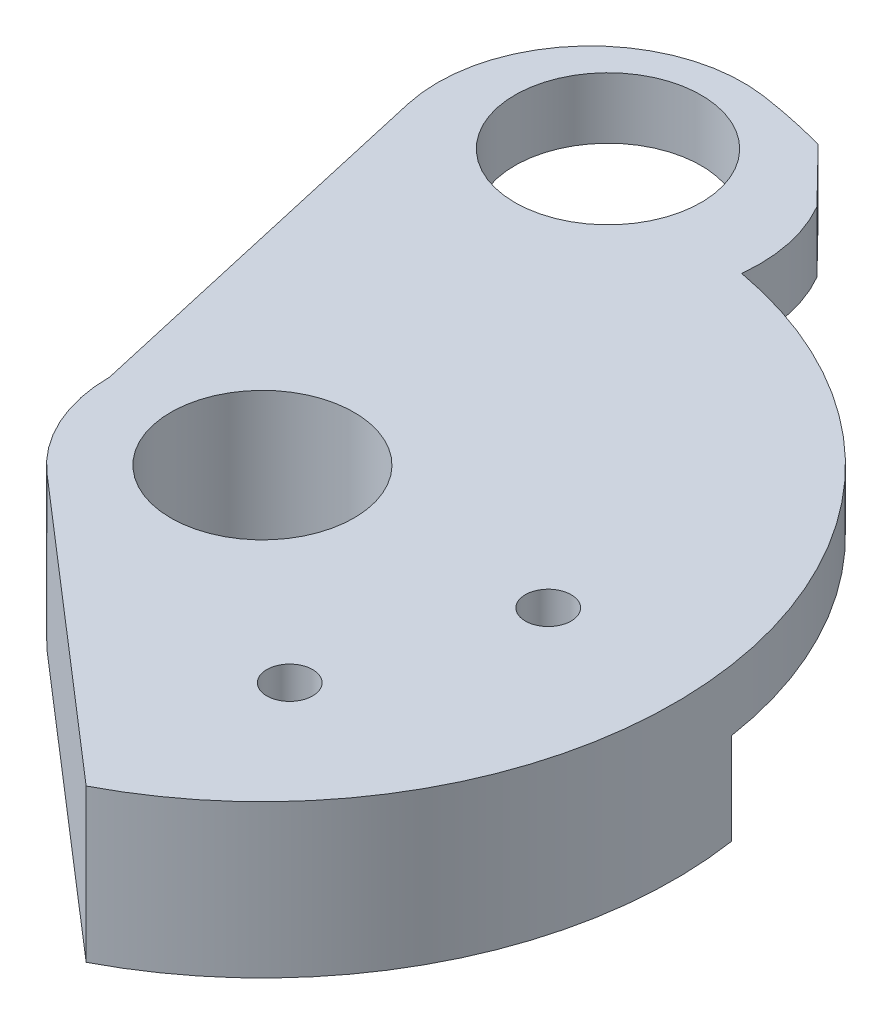
ISO-10303-21;
HEADER;
FILE_DESCRIPTION(('STEP AP214'),'2;1');
FILE_NAME('part.step','',(''),(''),'','','');
FILE_SCHEMA(('AUTOMOTIVE_DESIGN { 1 0 10303 214 1 1 1 1 }'));
ENDSEC;
DATA;
#1=APPLICATION_CONTEXT('core data for automotive mechanical design processes');
#2=APPLICATION_PROTOCOL_DEFINITION('international standard','automotive_design',2000,#1);
#3=PRODUCT_CONTEXT('',#1,'mechanical');
#4=PRODUCT('Part','Part','',(#3));
#5=PRODUCT_RELATED_PRODUCT_CATEGORY('part','',(#4));
#6=PRODUCT_DEFINITION_FORMATION('','',#4);
#7=PRODUCT_DEFINITION_CONTEXT('part definition',#1,'design');
#8=PRODUCT_DEFINITION('design','',#6,#7);
#9=PRODUCT_DEFINITION_SHAPE('','',#8);
#10=(LENGTH_UNIT() NAMED_UNIT(*) SI_UNIT(.MILLI.,.METRE.));
#11=(NAMED_UNIT(*) PLANE_ANGLE_UNIT() SI_UNIT($,.RADIAN.));
#12=(NAMED_UNIT(*) SI_UNIT($,.STERADIAN.) SOLID_ANGLE_UNIT());
#13=UNCERTAINTY_MEASURE_WITH_UNIT(LENGTH_MEASURE(1.E-05),#10,'distance_accuracy_value','');
#14=(GEOMETRIC_REPRESENTATION_CONTEXT(3) GLOBAL_UNCERTAINTY_ASSIGNED_CONTEXT((#13)) GLOBAL_UNIT_ASSIGNED_CONTEXT((#10,
#11,#12)) REPRESENTATION_CONTEXT('',''));
#15=CARTESIAN_POINT('',(0.,0.,0.));
#16=DIRECTION('',(0.,0.,1.));
#17=DIRECTION('',(1.,0.,0.));
#18=AXIS2_PLACEMENT_3D('',#15,#16,#17);
#19=CARTESIAN_POINT('',(-7.37456839969504,4.,4.55345127619053));
#20=DIRECTION('',(0.,-1.,0.));
#21=DIRECTION('',(0.,0.,-1.));
#22=AXIS2_PLACEMENT_3D('',#19,#20,#21);
#23=CYLINDRICAL_SURFACE('',#22,27.);
#24=DIRECTION('',(0.,-1.,0.));
#25=VECTOR('',#24,1.);
#26=CARTESIAN_POINT('',(5.05134482141443,4.,28.5241976271379));
#27=LINE('',#26,#25);
#28=CARTESIAN_POINT('',(5.05134482141443,4.,28.5241976271379));
#29=VERTEX_POINT('',#28);
#30=CARTESIAN_POINT('',(5.05134482141443,-6.,28.5241976271379));
#31=VERTEX_POINT('',#30);
#32=EDGE_CURVE('E158',#29,#31,#27,.T.);
#33=ORIENTED_EDGE('',*,*,#32,.T.);
#34=CARTESIAN_POINT('',(-7.37456839969504,-6.,4.55345127619053));
#35=DIRECTION('',(0.,1.,0.));
#36=DIRECTION('',(0.,0.,1.));
#37=AXIS2_PLACEMENT_3D('',#34,#35,#36);
#38=CIRCLE('',#37,27.);
#39=CARTESIAN_POINT('',(19.324871256468,-6.,0.535999092665891));
#40=VERTEX_POINT('',#39);
#41=EDGE_CURVE('E223',#31,#40,#38,.T.);
#42=ORIENTED_EDGE('',*,*,#41,.T.);
#43=DIRECTION('',(0.,1.,0.));
#44=VECTOR('',#43,1.);
#45=CARTESIAN_POINT('',(19.324871256468,-6.,0.535999092665891));
#46=LINE('',#45,#44);
#47=CARTESIAN_POINT('',(19.324871256468,0.,0.535999092665891));
#48=VERTEX_POINT('',#47);
#49=EDGE_CURVE('E211',#40,#48,#46,.T.);
#50=ORIENTED_EDGE('',*,*,#49,.T.);
#51=CARTESIAN_POINT('',(-7.37456839969504,0.,4.55345127619053));
#52=DIRECTION('',(0.,1.,0.));
#53=DIRECTION('',(0.,0.,1.));
#54=AXIS2_PLACEMENT_3D('',#51,#52,#53);
#55=CIRCLE('',#54,27.);
#56=CARTESIAN_POINT('',(-2.55289316750051,0.,-22.0125316334487));
#57=VERTEX_POINT('',#56);
#58=EDGE_CURVE('E163',#48,#57,#55,.T.);
#59=ORIENTED_EDGE('',*,*,#58,.T.);
#60=DIRECTION('',(0.,-1.,0.));
#61=VECTOR('',#60,1.);
#62=CARTESIAN_POINT('',(-2.55289316750051,4.,-22.0125316334487));
#63=LINE('',#62,#61);
#64=CARTESIAN_POINT('',(-2.55289316750051,4.,-22.0125316334487));
#65=VERTEX_POINT('',#64);
#66=EDGE_CURVE('E197',#65,#57,#63,.T.);
#67=ORIENTED_EDGE('',*,*,#66,.F.);
#68=CARTESIAN_POINT('',(-7.37456839969504,4.,4.55345127619053));
#69=DIRECTION('',(0.,1.,0.));
#70=DIRECTION('',(0.,0.,1.));
#71=AXIS2_PLACEMENT_3D('',#68,#69,#70);
#72=CIRCLE('',#71,27.);
#73=EDGE_CURVE('E97',#29,#65,#72,.T.);
#74=ORIENTED_EDGE('',*,*,#73,.F.);
#75=EDGE_LOOP('',(#33,#42,#50,#59,#67,#74));
#76=FACE_BOUND('',#75,.T.);
#77=ADVANCED_FACE('F45',(#76),#23,.T.);
#78=CARTESIAN_POINT('',(-12.7536225477424,4.,-23.1193833432682));
#79=DIRECTION('',(0.,-1.,0.));
#80=DIRECTION('',(0.,0.,-1.));
#81=AXIS2_PLACEMENT_3D('',#78,#79,#80);
#82=CYLINDRICAL_SURFACE('',#81,10.2606042997701);
#83=CARTESIAN_POINT('',(-12.7536225477424,0.,-23.1193833432682));
#84=DIRECTION('',(0.,1.,0.));
#85=DIRECTION('',(0.,0.,1.));
#86=AXIS2_PLACEMENT_3D('',#83,#84,#85);
#87=CIRCLE('',#86,10.2606042997701);
#88=CARTESIAN_POINT('',(-3.87383839621027,0.,-28.2603398708668));
#89=VERTEX_POINT('',#88);
#90=EDGE_CURVE('E167',#57,#89,#87,.T.);
#91=ORIENTED_EDGE('',*,*,#90,.T.);
#92=DIRECTION('',(0.,-1.,0.));
#93=VECTOR('',#92,1.);
#94=CARTESIAN_POINT('',(-3.87383839621027,4.,-28.2603398708668));
#95=LINE('',#94,#93);
#96=CARTESIAN_POINT('',(-3.87383839621027,4.,-28.2603398708668));
#97=VERTEX_POINT('',#96);
#98=EDGE_CURVE('E193',#97,#89,#95,.T.);
#99=ORIENTED_EDGE('',*,*,#98,.F.);
#100=CARTESIAN_POINT('',(-12.7536225477424,4.,-23.1193833432682));
#101=DIRECTION('',(0.,1.,0.));
#102=DIRECTION('',(0.,0.,1.));
#103=AXIS2_PLACEMENT_3D('',#100,#101,#102);
#104=CIRCLE('',#103,10.2606042997701);
#105=EDGE_CURVE('E232',#65,#97,#104,.T.);
#106=ORIENTED_EDGE('',*,*,#105,.F.);
#107=ORIENTED_EDGE('',*,*,#66,.T.);
#108=EDGE_LOOP('',(#91,#99,#106,#107));
#109=FACE_BOUND('',#108,.T.);
#110=ADVANCED_FACE('F231',(#109),#82,.T.);
#111=CARTESIAN_POINT('',(12.145901151846,4.,-11.8746147099477));
#112=DIRECTION('',(-0.71504720611453,0.,0.699076171120004));
#113=DIRECTION('',(0.699076171120004,0.,0.71504720611453));
#114=AXIS2_PLACEMENT_3D('',#111,#112,#113);
#115=PLANE('',#114);
#116=DIRECTION('',(-0.699076171120004,0.,-0.71504720611453));
#117=VECTOR('',#116,1.);
#118=CARTESIAN_POINT('',(12.145901151846,0.,-11.8746147099477));
#119=LINE('',#118,#117);
#120=CARTESIAN_POINT('',(-7.37456839969493,0.,-31.8410472555036));
#121=VERTEX_POINT('',#120);
#122=EDGE_CURVE('E170',#89,#121,#119,.T.);
#123=ORIENTED_EDGE('',*,*,#122,.T.);
#124=DIRECTION('',(0.,-1.,0.));
#125=VECTOR('',#124,1.);
#126=CARTESIAN_POINT('',(-7.37456839969493,4.,-31.8410472555036));
#127=LINE('',#126,#125);
#128=CARTESIAN_POINT('',(-7.37456839969493,4.,-31.8410472555036));
#129=VERTEX_POINT('',#128);
#130=EDGE_CURVE('E190',#129,#121,#127,.T.);
#131=ORIENTED_EDGE('',*,*,#130,.F.);
#132=DIRECTION('',(-0.699076171120004,0.,-0.71504720611453));
#133=VECTOR('',#132,1.);
#134=CARTESIAN_POINT('',(12.145901151846,4.,-11.8746147099477));
#135=LINE('',#134,#133);
#136=EDGE_CURVE('E238',#97,#129,#135,.T.);
#137=ORIENTED_EDGE('',*,*,#136,.F.);
#138=ORIENTED_EDGE('',*,*,#98,.T.);
#139=EDGE_LOOP('',(#123,#131,#137,#138));
#140=FACE_BOUND('',#139,.T.);
#141=ADVANCED_FACE('F307',(#140),#115,.F.);
#142=CARTESIAN_POINT('',(-17.374568399695,4.,4.5534512761906));
#143=DIRECTION('',(0.,-1.,0.));
#144=DIRECTION('',(0.,0.,-1.));
#145=AXIS2_PLACEMENT_3D('',#142,#143,#144);
#146=CYLINDRICAL_SURFACE('',#145,37.7433374699893);
#147=CARTESIAN_POINT('',(-17.374568399695,0.,4.5534512761906));
#148=DIRECTION('',(0.,1.,0.));
#149=DIRECTION('',(0.,0.,1.));
#150=AXIS2_PLACEMENT_3D('',#147,#148,#149);
#151=CIRCLE('',#150,37.7433374699893);
#152=CARTESIAN_POINT('',(-11.8829969447205,0.,-32.7882434674657));
#153=VERTEX_POINT('',#152);
#154=EDGE_CURVE('E84',#121,#153,#151,.T.);
#155=ORIENTED_EDGE('',*,*,#154,.T.);
#156=DIRECTION('',(0.,-1.,0.));
#157=VECTOR('',#156,1.);
#158=CARTESIAN_POINT('',(-11.8829969447205,4.,-32.7882434674657));
#159=LINE('',#158,#157);
#160=CARTESIAN_POINT('',(-11.8829969447205,4.,-32.7882434674657));
#161=VERTEX_POINT('',#160);
#162=EDGE_CURVE('E187',#161,#153,#159,.T.);
#163=ORIENTED_EDGE('',*,*,#162,.F.);
#164=CARTESIAN_POINT('',(-17.374568399695,4.,4.5534512761906));
#165=DIRECTION('',(0.,1.,0.));
#166=DIRECTION('',(0.,0.,1.));
#167=AXIS2_PLACEMENT_3D('',#164,#165,#166);
#168=CIRCLE('',#167,37.7433374699893);
#169=EDGE_CURVE('E245',#129,#161,#168,.T.);
#170=ORIENTED_EDGE('',*,*,#169,.F.);
#171=ORIENTED_EDGE('',*,*,#130,.T.);
#172=EDGE_LOOP('',(#155,#163,#170,#171));
#173=FACE_BOUND('',#172,.T.);
#174=ADVANCED_FACE('F251',(#173),#146,.T.);
#175=CARTESIAN_POINT('',(-13.3379746502138,4.,-22.8946576727946));
#176=DIRECTION('',(0.,-1.,0.));
#177=DIRECTION('',(0.,0.,-1.));
#178=AXIS2_PLACEMENT_3D('',#175,#176,#177);
#179=CYLINDRICAL_SURFACE('',#178,10.);
#180=CARTESIAN_POINT('',(-13.3379746502138,0.,-22.8946576727946));
#181=DIRECTION('',(0.,1.,0.));
#182=DIRECTION('',(0.,0.,1.));
#183=AXIS2_PLACEMENT_3D('',#180,#181,#182);
#184=CIRCLE('',#183,10.);
#185=CARTESIAN_POINT('',(-23.0909531790858,0.,-20.6857190554122));
#186=VERTEX_POINT('',#185);
#187=EDGE_CURVE('E91',#153,#186,#184,.T.);
#188=ORIENTED_EDGE('',*,*,#187,.T.);
#189=DIRECTION('',(0.,-1.,0.));
#190=VECTOR('',#189,1.);
#191=CARTESIAN_POINT('',(-23.0909531790858,4.,-20.6857190554122));
#192=LINE('',#191,#190);
#193=CARTESIAN_POINT('',(-23.0909531790858,4.,-20.6857190554122));
#194=VERTEX_POINT('',#193);
#195=EDGE_CURVE('E134',#194,#186,#192,.T.);
#196=ORIENTED_EDGE('',*,*,#195,.F.);
#197=CARTESIAN_POINT('',(-13.3379746502138,4.,-22.8946576727946));
#198=DIRECTION('',(0.,1.,0.));
#199=DIRECTION('',(0.,0.,1.));
#200=AXIS2_PLACEMENT_3D('',#197,#198,#199);
#201=CIRCLE('',#200,10.);
#202=EDGE_CURVE('E121',#161,#194,#201,.T.);
#203=ORIENTED_EDGE('',*,*,#202,.F.);
#204=ORIENTED_EDGE('',*,*,#162,.T.);
#205=EDGE_LOOP('',(#188,#196,#203,#204));
#206=FACE_BOUND('',#205,.T.);
#207=ADVANCED_FACE('F252',(#206),#179,.T.);
#208=CARTESIAN_POINT('',(-17.5077752937439,4.,3.96531181077831));
#209=DIRECTION('',(0.975297852887194,0.,-0.220893861738233));
#210=DIRECTION('',(-0.220893861738233,0.,-0.975297852887194));
#211=AXIS2_PLACEMENT_3D('',#208,#209,#210);
#212=PLANE('',#211);
#213=DIRECTION('',(0.220893861738233,0.,0.975297852887194));
#214=VECTOR('',#213,1.);
#215=CARTESIAN_POINT('',(-17.5077752937439,0.,3.96531181077831));
#216=LINE('',#215,#214);
#217=CARTESIAN_POINT('',(-17.374568399695,0.,4.5534512761906));
#218=VERTEX_POINT('',#217);
#219=EDGE_CURVE('E130',#186,#218,#216,.T.);
#220=ORIENTED_EDGE('',*,*,#219,.T.);
#221=DIRECTION('',(0.,-1.,0.));
#222=VECTOR('',#221,1.);
#223=CARTESIAN_POINT('',(-17.374568399695,4.,4.5534512761906));
#224=LINE('',#223,#222);
#225=CARTESIAN_POINT('',(-17.374568399695,4.,4.5534512761906));
#226=VERTEX_POINT('',#225);
#227=EDGE_CURVE('E127',#226,#218,#224,.T.);
#228=ORIENTED_EDGE('',*,*,#227,.F.);
#229=DIRECTION('',(0.220893861738233,0.,0.975297852887194));
#230=VECTOR('',#229,1.);
#231=CARTESIAN_POINT('',(-17.5077752937439,4.,3.96531181077831));
#232=LINE('',#231,#230);
#233=EDGE_CURVE('E113',#194,#226,#232,.T.);
#234=ORIENTED_EDGE('',*,*,#233,.F.);
#235=ORIENTED_EDGE('',*,*,#195,.T.);
#236=EDGE_LOOP('',(#220,#228,#234,#235));
#237=FACE_BOUND('',#236,.T.);
#238=ADVANCED_FACE('F128',(#237),#212,.F.);
#239=CARTESIAN_POINT('',(-7.37456839969504,4.,4.55345127619053));
#240=DIRECTION('',(0.,-1.,0.));
#241=DIRECTION('',(0.,0.,-1.));
#242=AXIS2_PLACEMENT_3D('',#239,#240,#241);
#243=CYLINDRICAL_SURFACE('',#242,10.);
#244=ORIENTED_EDGE('',*,*,#227,.T.);
#245=CARTESIAN_POINT('',(-7.37456839969504,0.,4.55345127619053));
#246=DIRECTION('',(0.,1.,0.));
#247=DIRECTION('',(0.,0.,1.));
#248=AXIS2_PLACEMENT_3D('',#245,#246,#247);
#249=CIRCLE('',#248,10.);
#250=CARTESIAN_POINT('',(-5.09422260554255,0.,-5.18307906367341));
#251=VERTEX_POINT('',#250);
#252=EDGE_CURVE('E11',#251,#218,#249,.T.);
#253=ORIENTED_EDGE('',*,*,#252,.F.);
#254=DIRECTION('',(0.,1.,0.));
#255=VECTOR('',#254,1.);
#256=CARTESIAN_POINT('',(-5.09422260554255,-6.,-5.18307906367341));
#257=LINE('',#256,#255);
#258=CARTESIAN_POINT('',(-5.09422260554255,-6.,-5.18307906367341));
#259=VERTEX_POINT('',#258);
#260=EDGE_CURVE('E164',#259,#251,#257,.T.);
#261=ORIENTED_EDGE('',*,*,#260,.F.);
#262=CARTESIAN_POINT('',(-7.37456839969504,-6.,4.55345127619053));
#263=DIRECTION('',(0.,1.,0.));
#264=DIRECTION('',(0.,0.,1.));
#265=AXIS2_PLACEMENT_3D('',#262,#263,#264);
#266=CIRCLE('',#265,10.);
#267=CARTESIAN_POINT('',(-13.9167375052431,-6.,12.1165209832878));
#268=VERTEX_POINT('',#267);
#269=EDGE_CURVE('E268',#259,#268,#266,.T.);
#270=ORIENTED_EDGE('',*,*,#269,.T.);
#271=DIRECTION('',(0.,-1.,0.));
#272=VECTOR('',#271,1.);
#273=CARTESIAN_POINT('',(-13.9167375052431,4.,12.1165209832878));
#274=LINE('',#273,#272);
#275=CARTESIAN_POINT('',(-13.9167375052431,4.,12.1165209832878));
#276=VERTEX_POINT('',#275);
#277=EDGE_CURVE('E135',#276,#268,#274,.T.);
#278=ORIENTED_EDGE('',*,*,#277,.F.);
#279=CARTESIAN_POINT('',(-7.37456839969504,4.,4.55345127619053));
#280=DIRECTION('',(0.,1.,0.));
#281=DIRECTION('',(0.,0.,1.));
#282=AXIS2_PLACEMENT_3D('',#279,#280,#281);
#283=CIRCLE('',#282,10.);
#284=EDGE_CURVE('E118',#226,#276,#283,.T.);
#285=ORIENTED_EDGE('',*,*,#284,.F.);
#286=EDGE_LOOP('',(#244,#253,#261,#270,#278,#285));
#287=FACE_BOUND('',#286,.T.);
#288=ADVANCED_FACE('F137',(#287),#243,.T.);
#289=CARTESIAN_POINT('',(5.86080358772524,4.,16.0022472108996));
#290=DIRECTION('',(0.,-1.,0.));
#291=DIRECTION('',(0.,0.,-1.));
#292=AXIS2_PLACEMENT_3D('',#289,#290,#291);
#293=CYLINDRICAL_SURFACE('',#292,1.5);
#294=CARTESIAN_POINT('',(5.86080358772524,4.,16.0022472108996));
#295=DIRECTION('',(0.,1.,0.));
#296=DIRECTION('',(0.,0.,1.));
#297=AXIS2_PLACEMENT_3D('',#294,#295,#296);
#298=CIRCLE('',#297,1.5);
#299=CARTESIAN_POINT('',(5.86080358772524,4.,17.5022472108996));
#300=VERTEX_POINT('',#299);
#301=EDGE_CURVE('E150',#300,#300,#298,.T.);
#302=ORIENTED_EDGE('',*,*,#301,.T.);
#303=EDGE_LOOP('',(#302));
#304=FACE_BOUND('',#303,.T.);
#305=CARTESIAN_POINT('',(5.86080358772524,-6.,16.0022472108996));
#306=DIRECTION('',(0.,1.,0.));
#307=DIRECTION('',(0.,0.,1.));
#308=AXIS2_PLACEMENT_3D('',#305,#306,#307);
#309=CIRCLE('',#308,1.5);
#310=CARTESIAN_POINT('',(5.86080358772524,-6.,17.5022472108996));
#311=VERTEX_POINT('',#310);
#312=EDGE_CURVE('E283',#311,#311,#309,.F.);
#313=ORIENTED_EDGE('',*,*,#312,.T.);
#314=EDGE_LOOP('',(#313));
#315=FACE_BOUND('',#314,.T.);
#316=ADVANCED_FACE('F321',(#304,#315),#293,.F.);
#317=CARTESIAN_POINT('',(-7.37456839969504,4.,4.55345127619053));
#318=DIRECTION('',(0.,-1.,0.));
#319=DIRECTION('',(0.,0.,-1.));
#320=AXIS2_PLACEMENT_3D('',#317,#318,#319);
#321=CYLINDRICAL_SURFACE('',#320,6.);
#322=CARTESIAN_POINT('',(-7.37456839969504,4.,4.55345127619053));
#323=DIRECTION('',(0.,1.,0.));
#324=DIRECTION('',(0.,0.,1.));
#325=AXIS2_PLACEMENT_3D('',#322,#323,#324);
#326=CIRCLE('',#325,6.);
#327=CARTESIAN_POINT('',(-7.37456839969504,4.,10.5534512761905));
#328=VERTEX_POINT('',#327);
#329=EDGE_CURVE('E143',#328,#328,#326,.T.);
#330=ORIENTED_EDGE('',*,*,#329,.T.);
#331=EDGE_LOOP('',(#330));
#332=FACE_BOUND('',#331,.T.);
#333=CARTESIAN_POINT('',(-7.37456839969504,-6.,4.55345127619053));
#334=DIRECTION('',(0.,1.,0.));
#335=DIRECTION('',(0.,0.,1.));
#336=AXIS2_PLACEMENT_3D('',#333,#334,#335);
#337=CIRCLE('',#336,6.);
#338=CARTESIAN_POINT('',(-7.37456839969504,-6.,10.5534512761905));
#339=VERTEX_POINT('',#338);
#340=EDGE_CURVE('E272',#339,#339,#337,.F.);
#341=ORIENTED_EDGE('',*,*,#340,.T.);
#342=EDGE_LOOP('',(#341));
#343=FACE_BOUND('',#342,.T.);
#344=ADVANCED_FACE('F324',(#332,#343),#321,.F.);
#345=CARTESIAN_POINT('',(-11.9514793928491,4.,13.81649882367));
#346=DIRECTION('',(0.654216910554804,0.,-0.75630697070973));
#347=DIRECTION('',(-0.75630697070973,0.,-0.654216910554803));
#348=AXIS2_PLACEMENT_3D('',#345,#346,#347);
#349=PLANE('',#348);
#350=ORIENTED_EDGE('',*,*,#277,.T.);
#351=DIRECTION('',(0.75630697070973,0.,0.654216910554804));
#352=VECTOR('',#351,1.);
#353=CARTESIAN_POINT('',(-11.9514793928491,-6.,13.81649882367));
#354=LINE('',#353,#352);
#355=EDGE_CURVE('E263',#268,#31,#354,.T.);
#356=ORIENTED_EDGE('',*,*,#355,.T.);
#357=ORIENTED_EDGE('',*,*,#32,.F.);
#358=DIRECTION('',(0.75630697070973,0.,0.654216910554804));
#359=VECTOR('',#358,1.);
#360=CARTESIAN_POINT('',(-11.9514793928491,4.,13.81649882367));
#361=LINE('',#360,#359);
#362=EDGE_CURVE('E63',#276,#29,#361,.T.);
#363=ORIENTED_EDGE('',*,*,#362,.F.);
#364=EDGE_LOOP('',(#350,#356,#357,#363));
#365=FACE_BOUND('',#364,.T.);
#366=ADVANCED_FACE('F262',(#365),#349,.F.);
#367=CARTESIAN_POINT('',(-14.001384251842,4.,-24.7054843104253));
#368=DIRECTION('',(0.,-1.,0.));
#369=DIRECTION('',(0.,0.,-1.));
#370=AXIS2_PLACEMENT_3D('',#367,#368,#369);
#371=CYLINDRICAL_SURFACE('',#370,6.1);
#372=CARTESIAN_POINT('',(-14.001384251842,4.,-24.7054843104253));
#373=DIRECTION('',(0.,1.,0.));
#374=DIRECTION('',(0.,0.,1.));
#375=AXIS2_PLACEMENT_3D('',#372,#373,#374);
#376=CIRCLE('',#375,6.1);
#377=CARTESIAN_POINT('',(-14.001384251842,4.,-18.6054843104253));
#378=VERTEX_POINT('',#377);
#379=EDGE_CURVE('E179',#378,#378,#376,.T.);
#380=ORIENTED_EDGE('',*,*,#379,.T.);
#381=EDGE_LOOP('',(#380));
#382=FACE_BOUND('',#381,.T.);
#383=CARTESIAN_POINT('',(-14.001384251842,0.,-24.7054843104253));
#384=DIRECTION('',(0.,1.,0.));
#385=DIRECTION('',(0.,0.,1.));
#386=AXIS2_PLACEMENT_3D('',#383,#384,#385);
#387=CIRCLE('',#386,6.1);
#388=CARTESIAN_POINT('',(-14.001384251842,0.,-18.6054843104253));
#389=VERTEX_POINT('',#388);
#390=EDGE_CURVE('E159',#389,#389,#387,.T.);
#391=ORIENTED_EDGE('',*,*,#390,.F.);
#392=EDGE_LOOP('',(#391));
#393=FACE_BOUND('',#392,.T.);
#394=ADVANCED_FACE('F47',(#382,#393),#371,.F.);
#395=CARTESIAN_POINT('',(10.0797741259901,4.,3.29015123421295));
#396=DIRECTION('',(0.,-1.,0.));
#397=DIRECTION('',(0.,0.,-1.));
#398=AXIS2_PLACEMENT_3D('',#395,#396,#397);
#399=CYLINDRICAL_SURFACE('',#398,1.49999999999999);
#400=CARTESIAN_POINT('',(10.0797741259901,4.,3.29015123421295));
#401=DIRECTION('',(0.,1.,0.));
#402=DIRECTION('',(0.,0.,1.));
#403=AXIS2_PLACEMENT_3D('',#400,#401,#402);
#404=CIRCLE('',#403,1.49999999999999);
#405=CARTESIAN_POINT('',(10.0797741259901,4.,4.79015123421294));
#406=VERTEX_POINT('',#405);
#407=EDGE_CURVE('E154',#406,#406,#404,.T.);
#408=ORIENTED_EDGE('',*,*,#407,.T.);
#409=EDGE_LOOP('',(#408));
#410=FACE_BOUND('',#409,.T.);
#411=CARTESIAN_POINT('',(10.0797741259901,-6.,3.29015123421295));
#412=DIRECTION('',(0.,1.,0.));
#413=DIRECTION('',(0.,0.,1.));
#414=AXIS2_PLACEMENT_3D('',#411,#412,#413);
#415=CIRCLE('',#414,1.49999999999999);
#416=CARTESIAN_POINT('',(10.0797741259901,-6.,4.79015123421294));
#417=VERTEX_POINT('',#416);
#418=EDGE_CURVE('E225',#417,#417,#415,.F.);
#419=ORIENTED_EDGE('',*,*,#418,.T.);
#420=EDGE_LOOP('',(#419));
#421=FACE_BOUND('',#420,.T.);
#422=ADVANCED_FACE('F293',(#410,#421),#399,.F.);
#423=CARTESIAN_POINT('',(0.,4.,0.));
#424=DIRECTION('',(0.,1.,0.));
#425=DIRECTION('',(0.,0.,1.));
#426=AXIS2_PLACEMENT_3D('',#423,#424,#425);
#427=PLANE('',#426);
#428=ORIENTED_EDGE('',*,*,#233,.T.);
#429=ORIENTED_EDGE('',*,*,#284,.T.);
#430=ORIENTED_EDGE('',*,*,#362,.T.);
#431=ORIENTED_EDGE('',*,*,#73,.T.);
#432=ORIENTED_EDGE('',*,*,#105,.T.);
#433=ORIENTED_EDGE('',*,*,#136,.T.);
#434=ORIENTED_EDGE('',*,*,#169,.T.);
#435=ORIENTED_EDGE('',*,*,#202,.T.);
#436=EDGE_LOOP('',(#428,#429,#430,#431,#432,#433,#434,#435));
#437=FACE_BOUND('',#436,.T.);
#438=ORIENTED_EDGE('',*,*,#379,.F.);
#439=EDGE_LOOP('',(#438));
#440=FACE_BOUND('',#439,.T.);
#441=ORIENTED_EDGE('',*,*,#407,.F.);
#442=EDGE_LOOP('',(#441));
#443=FACE_BOUND('',#442,.T.);
#444=ORIENTED_EDGE('',*,*,#301,.F.);
#445=EDGE_LOOP('',(#444));
#446=FACE_BOUND('',#445,.T.);
#447=ORIENTED_EDGE('',*,*,#329,.F.);
#448=EDGE_LOOP('',(#447));
#449=FACE_BOUND('',#448,.T.);
#450=ADVANCED_FACE('F115',(#437,#440,#443,#446,#449),#427,.T.);
#451=CARTESIAN_POINT('',(0.,0.,0.));
#452=DIRECTION('',(0.,1.,0.));
#453=DIRECTION('',(0.,0.,1.));
#454=AXIS2_PLACEMENT_3D('',#451,#452,#453);
#455=PLANE('',#454);
#456=ORIENTED_EDGE('',*,*,#390,.T.);
#457=EDGE_LOOP('',(#456));
#458=FACE_BOUND('',#457,.T.);
#459=DIRECTION('',(0.973653033986394,0.,0.228034579415249));
#460=VECTOR('',#459,1.);
#461=CARTESIAN_POINT('',(0.885882814434564,0.,-3.78250742603356));
#462=LINE('',#461,#460);
#463=EDGE_CURVE('E55',#251,#48,#462,.T.);
#464=ORIENTED_EDGE('',*,*,#463,.F.);
#465=ORIENTED_EDGE('',*,*,#252,.T.);
#466=ORIENTED_EDGE('',*,*,#219,.F.);
#467=ORIENTED_EDGE('',*,*,#187,.F.);
#468=ORIENTED_EDGE('',*,*,#154,.F.);
#469=ORIENTED_EDGE('',*,*,#122,.F.);
#470=ORIENTED_EDGE('',*,*,#90,.F.);
#471=ORIENTED_EDGE('',*,*,#58,.F.);
#472=EDGE_LOOP('',(#464,#465,#466,#467,#468,#469,#470,#471));
#473=FACE_BOUND('',#472,.T.);
#474=ADVANCED_FACE('F227',(#458,#473),#455,.F.);
#475=CARTESIAN_POINT('',(0.885882814434564,-6.,-3.78250742603356));
#476=DIRECTION('',(-0.228034579415249,0.,0.973653033986394));
#477=DIRECTION('',(0.973653033986394,0.,0.228034579415249));
#478=AXIS2_PLACEMENT_3D('',#475,#476,#477);
#479=PLANE('',#478);
#480=ORIENTED_EDGE('',*,*,#260,.T.);
#481=ORIENTED_EDGE('',*,*,#463,.T.);
#482=ORIENTED_EDGE('',*,*,#49,.F.);
#483=DIRECTION('',(0.973653033986394,0.,0.228034579415249));
#484=VECTOR('',#483,1.);
#485=CARTESIAN_POINT('',(0.885882814434564,-6.,-3.78250742603356));
#486=LINE('',#485,#484);
#487=EDGE_CURVE('E280',#259,#40,#486,.T.);
#488=ORIENTED_EDGE('',*,*,#487,.F.);
#489=EDGE_LOOP('',(#480,#481,#482,#488));
#490=FACE_BOUND('',#489,.T.);
#491=ADVANCED_FACE('F208',(#490),#479,.F.);
#492=CARTESIAN_POINT('',(0.,-6.,0.));
#493=DIRECTION('',(0.,1.,0.));
#494=DIRECTION('',(0.,0.,1.));
#495=AXIS2_PLACEMENT_3D('',#492,#493,#494);
#496=PLANE('',#495);
#497=ORIENTED_EDGE('',*,*,#340,.F.);
#498=EDGE_LOOP('',(#497));
#499=FACE_BOUND('',#498,.T.);
#500=ORIENTED_EDGE('',*,*,#269,.F.);
#501=ORIENTED_EDGE('',*,*,#487,.T.);
#502=ORIENTED_EDGE('',*,*,#41,.F.);
#503=ORIENTED_EDGE('',*,*,#355,.F.);
#504=EDGE_LOOP('',(#500,#501,#502,#503));
#505=FACE_BOUND('',#504,.T.);
#506=ORIENTED_EDGE('',*,*,#312,.F.);
#507=EDGE_LOOP('',(#506));
#508=FACE_BOUND('',#507,.T.);
#509=ORIENTED_EDGE('',*,*,#418,.F.);
#510=EDGE_LOOP('',(#509));
#511=FACE_BOUND('',#510,.T.);
#512=ADVANCED_FACE('F266',(#499,#505,#508,#511),#496,.F.);
#513=CLOSED_SHELL('',(#77,#110,#141,#174,#207,#238,#288,#316,#344,#366,#394,#422,#450,#474,#491,#512));
#514=MANIFOLD_SOLID_BREP('B2',#513);
#515=ADVANCED_BREP_SHAPE_REPRESENTATION('',(#18,#514),#14);
#516=SHAPE_DEFINITION_REPRESENTATION(#9,#515);
ENDSEC;
END-ISO-10303-21;
